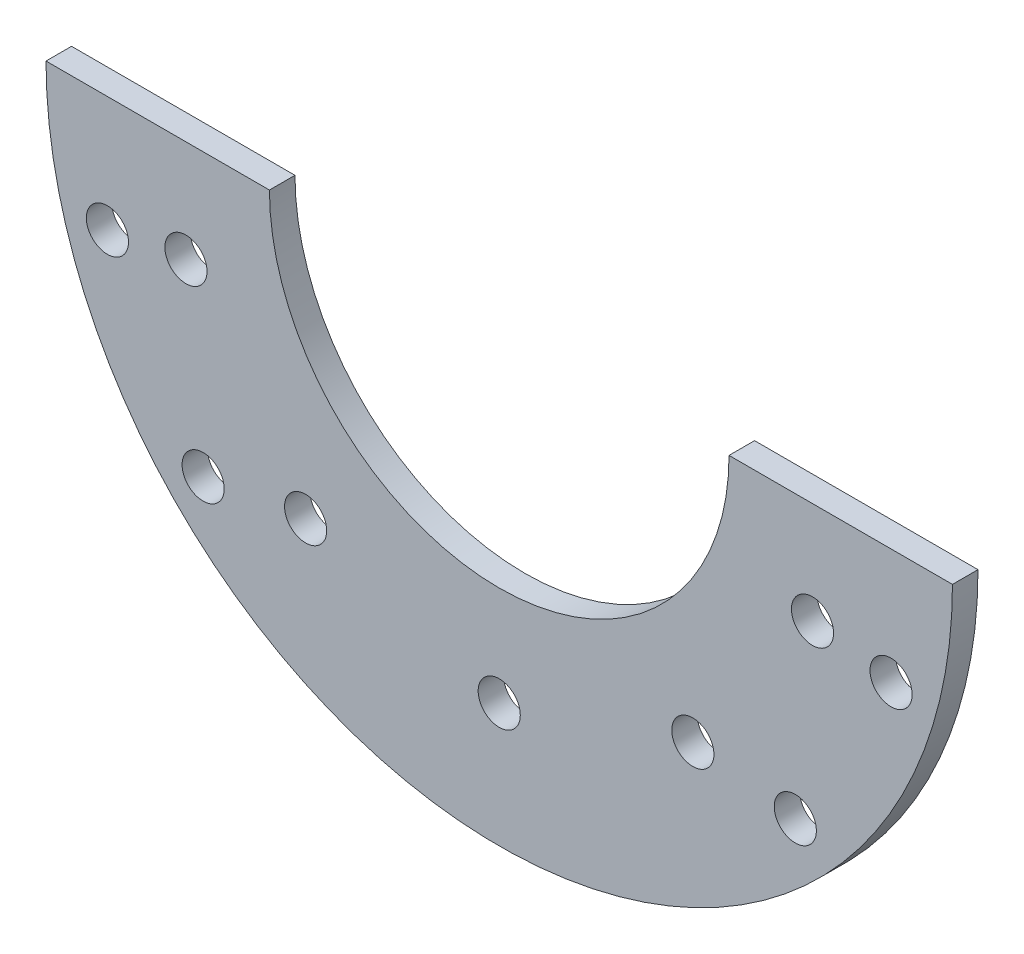
ISO-10303-21;
HEADER;
FILE_DESCRIPTION(('STEP AP214'),'2;1');
FILE_NAME('part.step','',(''),(''),'','','');
FILE_SCHEMA(('AUTOMOTIVE_DESIGN { 1 0 10303 214 1 1 1 1 }'));
ENDSEC;
DATA;
#1=APPLICATION_CONTEXT('core data for automotive mechanical design processes');
#2=APPLICATION_PROTOCOL_DEFINITION('international standard','automotive_design',2000,#1);
#3=PRODUCT_CONTEXT('',#1,'mechanical');
#4=PRODUCT('Part','Part','',(#3));
#5=PRODUCT_RELATED_PRODUCT_CATEGORY('part','',(#4));
#6=PRODUCT_DEFINITION_FORMATION('','',#4);
#7=PRODUCT_DEFINITION_CONTEXT('part definition',#1,'design');
#8=PRODUCT_DEFINITION('design','',#6,#7);
#9=PRODUCT_DEFINITION_SHAPE('','',#8);
#10=(LENGTH_UNIT() NAMED_UNIT(*) SI_UNIT(.MILLI.,.METRE.));
#11=(NAMED_UNIT(*) PLANE_ANGLE_UNIT() SI_UNIT($,.RADIAN.));
#12=(NAMED_UNIT(*) SI_UNIT($,.STERADIAN.) SOLID_ANGLE_UNIT());
#13=UNCERTAINTY_MEASURE_WITH_UNIT(LENGTH_MEASURE(1.E-05),#10,'distance_accuracy_value','');
#14=(GEOMETRIC_REPRESENTATION_CONTEXT(3) GLOBAL_UNCERTAINTY_ASSIGNED_CONTEXT((#13)) GLOBAL_UNIT_ASSIGNED_CONTEXT((#10,
#11,#12)) REPRESENTATION_CONTEXT('',''));
#15=CARTESIAN_POINT('',(0.,0.,0.));
#16=DIRECTION('',(0.,0.,1.));
#17=DIRECTION('',(1.,0.,0.));
#18=AXIS2_PLACEMENT_3D('',#15,#16,#17);
#19=CARTESIAN_POINT('',(0.,0.,0.));
#20=DIRECTION('',(0.,1.,0.));
#21=DIRECTION('',(0.,0.,1.));
#22=AXIS2_PLACEMENT_3D('',#19,#20,#21);
#23=PLANE('',#22);
#24=DIRECTION('',(-1.,0.,0.));
#25=VECTOR('',#24,1.);
#26=CARTESIAN_POINT('',(0.,0.,4.));
#27=LINE('',#26,#25);
#28=CARTESIAN_POINT('',(71.,0.,4.));
#29=VERTEX_POINT('',#28);
#30=CARTESIAN_POINT('',(36.,0.,4.));
#31=VERTEX_POINT('',#30);
#32=EDGE_CURVE('E80',#29,#31,#27,.T.);
#33=ORIENTED_EDGE('',*,*,#32,.F.);
#34=DIRECTION('',(0.,0.,-1.));
#35=VECTOR('',#34,1.);
#36=CARTESIAN_POINT('',(71.,0.,4.));
#37=LINE('',#36,#35);
#38=CARTESIAN_POINT('',(71.,0.,0.));
#39=VERTEX_POINT('',#38);
#40=EDGE_CURVE('E89',#29,#39,#37,.T.);
#41=ORIENTED_EDGE('',*,*,#40,.T.);
#42=DIRECTION('',(-1.,0.,0.));
#43=VECTOR('',#42,1.);
#44=CARTESIAN_POINT('',(0.,0.,0.));
#45=LINE('',#44,#43);
#46=CARTESIAN_POINT('',(36.,0.,0.));
#47=VERTEX_POINT('',#46);
#48=EDGE_CURVE('E90',#39,#47,#45,.T.);
#49=ORIENTED_EDGE('',*,*,#48,.T.);
#50=DIRECTION('',(0.,0.,-1.));
#51=VECTOR('',#50,1.);
#52=CARTESIAN_POINT('',(36.,0.,4.));
#53=LINE('',#52,#51);
#54=EDGE_CURVE('E50',#31,#47,#53,.T.);
#55=ORIENTED_EDGE('',*,*,#54,.F.);
#56=EDGE_LOOP('',(#33,#41,#49,#55));
#57=FACE_BOUND('',#56,.T.);
#58=ADVANCED_FACE('F33',(#57),#23,.T.);
#59=CARTESIAN_POINT('',(-36.,0.,0.));
#60=VERTEX_POINT('',#59);
#61=CARTESIAN_POINT('',(-71.,0.,0.));
#62=VERTEX_POINT('',#61);
#63=EDGE_CURVE('E94',#60,#62,#45,.T.);
#64=ORIENTED_EDGE('',*,*,#63,.T.);
#65=DIRECTION('',(0.,0.,-1.));
#66=VECTOR('',#65,1.);
#67=CARTESIAN_POINT('',(-71.,0.,4.));
#68=LINE('',#67,#66);
#69=CARTESIAN_POINT('',(-71.,0.,4.));
#70=VERTEX_POINT('',#69);
#71=EDGE_CURVE('E95',#62,#70,#68,.F.);
#72=ORIENTED_EDGE('',*,*,#71,.T.);
#73=CARTESIAN_POINT('',(-36.,0.,4.));
#74=VERTEX_POINT('',#73);
#75=EDGE_CURVE('E81',#74,#70,#27,.T.);
#76=ORIENTED_EDGE('',*,*,#75,.F.);
#77=DIRECTION('',(0.,0.,-1.));
#78=VECTOR('',#77,1.);
#79=CARTESIAN_POINT('',(-36.,0.,4.));
#80=LINE('',#79,#78);
#81=EDGE_CURVE('E58',#60,#74,#80,.F.);
#82=ORIENTED_EDGE('',*,*,#81,.F.);
#83=EDGE_LOOP('',(#64,#72,#76,#82));
#84=FACE_BOUND('',#83,.T.);
#85=ADVANCED_FACE('F161',(#84),#23,.T.);
#86=CARTESIAN_POINT('',(49.0745162408297,-15.9452769097482,4.));
#87=DIRECTION('',(0.,0.,-1.));
#88=DIRECTION('',(-1.,0.,0.));
#89=AXIS2_PLACEMENT_3D('',#86,#87,#88);
#90=CYLINDRICAL_SURFACE('',#89,3.3);
#91=CARTESIAN_POINT('',(49.0745162408297,-15.9452769097482,4.));
#92=DIRECTION('',(0.,0.,1.));
#93=DIRECTION('',(1.,0.,0.));
#94=AXIS2_PLACEMENT_3D('',#91,#92,#93);
#95=CIRCLE('',#94,3.3);
#96=CARTESIAN_POINT('',(52.3745162408296,-15.9452769097482,4.));
#97=VERTEX_POINT('',#96);
#98=EDGE_CURVE('E103',#97,#97,#95,.T.);
#99=ORIENTED_EDGE('',*,*,#98,.T.);
#100=EDGE_LOOP('',(#99));
#101=FACE_BOUND('',#100,.T.);
#102=CARTESIAN_POINT('',(49.0745162408297,-15.9452769097482,0.));
#103=DIRECTION('',(0.,0.,1.));
#104=DIRECTION('',(1.,0.,0.));
#105=AXIS2_PLACEMENT_3D('',#102,#103,#104);
#106=CIRCLE('',#105,3.3);
#107=CARTESIAN_POINT('',(52.3745162408296,-15.9452769097482,0.));
#108=VERTEX_POINT('',#107);
#109=EDGE_CURVE('E107',#108,#108,#106,.T.);
#110=ORIENTED_EDGE('',*,*,#109,.F.);
#111=EDGE_LOOP('',(#110));
#112=FACE_BOUND('',#111,.T.);
#113=ADVANCED_FACE('F163',(#101,#112),#90,.F.);
#114=CARTESIAN_POINT('',(30.3297190182908,-41.7452769097479,4.));
#115=DIRECTION('',(0.,0.,-1.));
#116=DIRECTION('',(-1.,0.,0.));
#117=AXIS2_PLACEMENT_3D('',#114,#115,#116);
#118=CYLINDRICAL_SURFACE('',#117,3.29999999999999);
#119=CARTESIAN_POINT('',(30.3297190182908,-41.7452769097479,4.));
#120=DIRECTION('',(0.,0.,1.));
#121=DIRECTION('',(1.,0.,0.));
#122=AXIS2_PLACEMENT_3D('',#119,#120,#121);
#123=CIRCLE('',#122,3.29999999999999);
#124=CARTESIAN_POINT('',(33.6297190182908,-41.7452769097479,4.));
#125=VERTEX_POINT('',#124);
#126=EDGE_CURVE('E112',#125,#125,#123,.T.);
#127=ORIENTED_EDGE('',*,*,#126,.T.);
#128=EDGE_LOOP('',(#127));
#129=FACE_BOUND('',#128,.T.);
#130=CARTESIAN_POINT('',(30.3297190182908,-41.7452769097479,0.));
#131=DIRECTION('',(0.,0.,1.));
#132=DIRECTION('',(1.,0.,0.));
#133=AXIS2_PLACEMENT_3D('',#130,#131,#132);
#134=CIRCLE('',#133,3.29999999999999);
#135=CARTESIAN_POINT('',(33.6297190182908,-41.7452769097479,0.));
#136=VERTEX_POINT('',#135);
#137=EDGE_CURVE('E115',#136,#136,#134,.T.);
#138=ORIENTED_EDGE('',*,*,#137,.F.);
#139=EDGE_LOOP('',(#138));
#140=FACE_BOUND('',#139,.T.);
#141=ADVANCED_FACE('F169',(#129,#140),#118,.F.);
#142=CARTESIAN_POINT('',(-1.06165076729781E-12,-51.6,4.));
#143=DIRECTION('',(0.,0.,-1.));
#144=DIRECTION('',(-1.,0.,0.));
#145=AXIS2_PLACEMENT_3D('',#142,#143,#144);
#146=CYLINDRICAL_SURFACE('',#145,3.30000000000001);
#147=CARTESIAN_POINT('',(-1.06165076729781E-12,-51.6,4.));
#148=DIRECTION('',(0.,0.,1.));
#149=DIRECTION('',(1.,0.,0.));
#150=AXIS2_PLACEMENT_3D('',#147,#148,#149);
#151=CIRCLE('',#150,3.30000000000001);
#152=CARTESIAN_POINT('',(3.29999999999894,-51.6,4.));
#153=VERTEX_POINT('',#152);
#154=EDGE_CURVE('E118',#153,#153,#151,.T.);
#155=ORIENTED_EDGE('',*,*,#154,.T.);
#156=EDGE_LOOP('',(#155));
#157=FACE_BOUND('',#156,.T.);
#158=CARTESIAN_POINT('',(-1.06165076729781E-12,-51.6,0.));
#159=DIRECTION('',(0.,0.,1.));
#160=DIRECTION('',(1.,0.,0.));
#161=AXIS2_PLACEMENT_3D('',#158,#159,#160);
#162=CIRCLE('',#161,3.30000000000001);
#163=CARTESIAN_POINT('',(3.29999999999894,-51.6,0.));
#164=VERTEX_POINT('',#163);
#165=EDGE_CURVE('E121',#164,#164,#162,.T.);
#166=ORIENTED_EDGE('',*,*,#165,.F.);
#167=EDGE_LOOP('',(#166));
#168=FACE_BOUND('',#167,.T.);
#169=ADVANCED_FACE('F238',(#157,#168),#146,.F.);
#170=CARTESIAN_POINT('',(-30.329719018292,-41.7452769097471,4.));
#171=DIRECTION('',(0.,0.,-1.));
#172=DIRECTION('',(-1.,0.,0.));
#173=AXIS2_PLACEMENT_3D('',#170,#171,#172);
#174=CYLINDRICAL_SURFACE('',#173,3.3);
#175=CARTESIAN_POINT('',(-30.329719018292,-41.7452769097471,4.));
#176=DIRECTION('',(0.,0.,1.));
#177=DIRECTION('',(1.,0.,0.));
#178=AXIS2_PLACEMENT_3D('',#175,#176,#177);
#179=CIRCLE('',#178,3.3);
#180=CARTESIAN_POINT('',(-27.029719018292,-41.7452769097471,4.));
#181=VERTEX_POINT('',#180);
#182=EDGE_CURVE('E124',#181,#181,#179,.T.);
#183=ORIENTED_EDGE('',*,*,#182,.T.);
#184=EDGE_LOOP('',(#183));
#185=FACE_BOUND('',#184,.T.);
#186=CARTESIAN_POINT('',(-30.329719018292,-41.7452769097471,0.));
#187=DIRECTION('',(0.,0.,1.));
#188=DIRECTION('',(1.,0.,0.));
#189=AXIS2_PLACEMENT_3D('',#186,#187,#188);
#190=CIRCLE('',#189,3.3);
#191=CARTESIAN_POINT('',(-27.029719018292,-41.7452769097471,0.));
#192=VERTEX_POINT('',#191);
#193=EDGE_CURVE('E127',#192,#192,#190,.T.);
#194=ORIENTED_EDGE('',*,*,#193,.F.);
#195=EDGE_LOOP('',(#194));
#196=FACE_BOUND('',#195,.T.);
#197=ADVANCED_FACE('F230',(#185,#196),#174,.F.);
#198=CARTESIAN_POINT('',(-49.0745162408299,-15.9452769097473,4.));
#199=DIRECTION('',(0.,0.,-1.));
#200=DIRECTION('',(-1.,0.,0.));
#201=AXIS2_PLACEMENT_3D('',#198,#199,#200);
#202=CYLINDRICAL_SURFACE('',#201,3.29999999999998);
#203=CARTESIAN_POINT('',(-49.0745162408299,-15.9452769097473,4.));
#204=DIRECTION('',(0.,0.,1.));
#205=DIRECTION('',(1.,0.,0.));
#206=AXIS2_PLACEMENT_3D('',#203,#204,#205);
#207=CIRCLE('',#206,3.29999999999998);
#208=CARTESIAN_POINT('',(-45.7745162408299,-15.9452769097473,4.));
#209=VERTEX_POINT('',#208);
#210=EDGE_CURVE('E130',#209,#209,#207,.T.);
#211=ORIENTED_EDGE('',*,*,#210,.T.);
#212=EDGE_LOOP('',(#211));
#213=FACE_BOUND('',#212,.T.);
#214=CARTESIAN_POINT('',(-49.0745162408299,-15.9452769097473,0.));
#215=DIRECTION('',(0.,0.,1.));
#216=DIRECTION('',(1.,0.,0.));
#217=AXIS2_PLACEMENT_3D('',#214,#215,#216);
#218=CIRCLE('',#217,3.29999999999998);
#219=CARTESIAN_POINT('',(-45.7745162408299,-15.9452769097473,0.));
#220=VERTEX_POINT('',#219);
#221=EDGE_CURVE('E133',#220,#220,#218,.T.);
#222=ORIENTED_EDGE('',*,*,#221,.F.);
#223=EDGE_LOOP('',(#222));
#224=FACE_BOUND('',#223,.T.);
#225=ADVANCED_FACE('F222',(#213,#224),#202,.F.);
#226=CARTESIAN_POINT('',(61.3818151141923,-18.118299403838,4.));
#227=DIRECTION('',(0.,0.,-1.));
#228=DIRECTION('',(-1.,0.,0.));
#229=AXIS2_PLACEMENT_3D('',#226,#227,#228);
#230=CYLINDRICAL_SURFACE('',#229,3.29999999999999);
#231=CARTESIAN_POINT('',(61.3818151141923,-18.118299403838,4.));
#232=DIRECTION('',(0.,0.,1.));
#233=DIRECTION('',(1.,0.,0.));
#234=AXIS2_PLACEMENT_3D('',#231,#232,#233);
#235=CIRCLE('',#234,3.29999999999999);
#236=CARTESIAN_POINT('',(64.6818151141923,-18.118299403838,4.));
#237=VERTEX_POINT('',#236);
#238=EDGE_CURVE('E136',#237,#237,#235,.T.);
#239=ORIENTED_EDGE('',*,*,#238,.T.);
#240=EDGE_LOOP('',(#239));
#241=FACE_BOUND('',#240,.T.);
#242=CARTESIAN_POINT('',(61.3818151141923,-18.118299403838,0.));
#243=DIRECTION('',(0.,0.,1.));
#244=DIRECTION('',(1.,0.,0.));
#245=AXIS2_PLACEMENT_3D('',#242,#243,#244);
#246=CIRCLE('',#245,3.29999999999999);
#247=CARTESIAN_POINT('',(64.6818151141923,-18.118299403838,0.));
#248=VERTEX_POINT('',#247);
#249=EDGE_CURVE('E139',#248,#248,#246,.T.);
#250=ORIENTED_EDGE('',*,*,#249,.F.);
#251=EDGE_LOOP('',(#250));
#252=FACE_BOUND('',#251,.T.);
#253=ADVANCED_FACE('F214',(#241,#252),#230,.F.);
#254=CARTESIAN_POINT('',(46.3818151141923,-44.0990615173711,4.));
#255=DIRECTION('',(0.,0.,-1.));
#256=DIRECTION('',(-1.,0.,0.));
#257=AXIS2_PLACEMENT_3D('',#254,#255,#256);
#258=CYLINDRICAL_SURFACE('',#257,3.3);
#259=CARTESIAN_POINT('',(46.3818151141923,-44.0990615173711,4.));
#260=DIRECTION('',(0.,0.,1.));
#261=DIRECTION('',(1.,0.,0.));
#262=AXIS2_PLACEMENT_3D('',#259,#260,#261);
#263=CIRCLE('',#262,3.3);
#264=CARTESIAN_POINT('',(49.6818151141923,-44.0990615173711,4.));
#265=VERTEX_POINT('',#264);
#266=EDGE_CURVE('E142',#265,#265,#263,.T.);
#267=ORIENTED_EDGE('',*,*,#266,.T.);
#268=EDGE_LOOP('',(#267));
#269=FACE_BOUND('',#268,.T.);
#270=CARTESIAN_POINT('',(46.3818151141923,-44.0990615173711,0.));
#271=DIRECTION('',(0.,0.,1.));
#272=DIRECTION('',(1.,0.,0.));
#273=AXIS2_PLACEMENT_3D('',#270,#271,#272);
#274=CIRCLE('',#273,3.3);
#275=CARTESIAN_POINT('',(49.6818151141923,-44.0990615173711,0.));
#276=VERTEX_POINT('',#275);
#277=EDGE_CURVE('E145',#276,#276,#274,.T.);
#278=ORIENTED_EDGE('',*,*,#277,.F.);
#279=EDGE_LOOP('',(#278));
#280=FACE_BOUND('',#279,.T.);
#281=ADVANCED_FACE('F207',(#269,#280),#258,.F.);
#282=CARTESIAN_POINT('',(-46.3818151141923,-44.0990615173712,4.));
#283=DIRECTION('',(0.,0.,-1.));
#284=DIRECTION('',(-1.,0.,0.));
#285=AXIS2_PLACEMENT_3D('',#282,#283,#284);
#286=CYLINDRICAL_SURFACE('',#285,3.3);
#287=CARTESIAN_POINT('',(-46.3818151141923,-44.0990615173712,4.));
#288=DIRECTION('',(0.,0.,1.));
#289=DIRECTION('',(1.,0.,0.));
#290=AXIS2_PLACEMENT_3D('',#287,#288,#289);
#291=CIRCLE('',#290,3.3);
#292=CARTESIAN_POINT('',(-43.0818151141923,-44.0990615173712,4.));
#293=VERTEX_POINT('',#292);
#294=EDGE_CURVE('E148',#293,#293,#291,.T.);
#295=ORIENTED_EDGE('',*,*,#294,.T.);
#296=EDGE_LOOP('',(#295));
#297=FACE_BOUND('',#296,.T.);
#298=CARTESIAN_POINT('',(-46.3818151141923,-44.0990615173712,0.));
#299=DIRECTION('',(0.,0.,1.));
#300=DIRECTION('',(1.,0.,0.));
#301=AXIS2_PLACEMENT_3D('',#298,#299,#300);
#302=CIRCLE('',#301,3.3);
#303=CARTESIAN_POINT('',(-43.0818151141923,-44.0990615173712,0.));
#304=VERTEX_POINT('',#303);
#305=EDGE_CURVE('E151',#304,#304,#302,.T.);
#306=ORIENTED_EDGE('',*,*,#305,.F.);
#307=EDGE_LOOP('',(#306));
#308=FACE_BOUND('',#307,.T.);
#309=ADVANCED_FACE('F200',(#297,#308),#286,.F.);
#310=CARTESIAN_POINT('',(-61.3818151141923,-18.118299403838,4.));
#311=DIRECTION('',(0.,0.,-1.));
#312=DIRECTION('',(-1.,0.,0.));
#313=AXIS2_PLACEMENT_3D('',#310,#311,#312);
#314=CYLINDRICAL_SURFACE('',#313,3.3);
#315=CARTESIAN_POINT('',(-61.3818151141923,-18.118299403838,4.));
#316=DIRECTION('',(0.,0.,1.));
#317=DIRECTION('',(1.,0.,0.));
#318=AXIS2_PLACEMENT_3D('',#315,#316,#317);
#319=CIRCLE('',#318,3.3);
#320=CARTESIAN_POINT('',(-58.0818151141923,-18.118299403838,4.));
#321=VERTEX_POINT('',#320);
#322=EDGE_CURVE('E42',#321,#321,#319,.T.);
#323=ORIENTED_EDGE('',*,*,#322,.T.);
#324=EDGE_LOOP('',(#323));
#325=FACE_BOUND('',#324,.T.);
#326=CARTESIAN_POINT('',(-61.3818151141923,-18.118299403838,0.));
#327=DIRECTION('',(0.,0.,1.));
#328=DIRECTION('',(1.,0.,0.));
#329=AXIS2_PLACEMENT_3D('',#326,#327,#328);
#330=CIRCLE('',#329,3.3);
#331=CARTESIAN_POINT('',(-58.0818151141923,-18.118299403838,0.));
#332=VERTEX_POINT('',#331);
#333=EDGE_CURVE('E11',#332,#332,#330,.T.);
#334=ORIENTED_EDGE('',*,*,#333,.F.);
#335=EDGE_LOOP('',(#334));
#336=FACE_BOUND('',#335,.T.);
#337=ADVANCED_FACE('F173',(#325,#336),#314,.F.);
#338=CARTESIAN_POINT('',(0.,0.,0.));
#339=DIRECTION('',(0.,0.,1.));
#340=DIRECTION('',(1.,0.,0.));
#341=AXIS2_PLACEMENT_3D('',#338,#339,#340);
#342=PLANE('',#341);
#343=ORIENTED_EDGE('',*,*,#333,.T.);
#344=EDGE_LOOP('',(#343));
#345=FACE_BOUND('',#344,.T.);
#346=ORIENTED_EDGE('',*,*,#305,.T.);
#347=EDGE_LOOP('',(#346));
#348=FACE_BOUND('',#347,.T.);
#349=ORIENTED_EDGE('',*,*,#277,.T.);
#350=EDGE_LOOP('',(#349));
#351=FACE_BOUND('',#350,.T.);
#352=ORIENTED_EDGE('',*,*,#249,.T.);
#353=EDGE_LOOP('',(#352));
#354=FACE_BOUND('',#353,.T.);
#355=ORIENTED_EDGE('',*,*,#221,.T.);
#356=EDGE_LOOP('',(#355));
#357=FACE_BOUND('',#356,.T.);
#358=ORIENTED_EDGE('',*,*,#193,.T.);
#359=EDGE_LOOP('',(#358));
#360=FACE_BOUND('',#359,.T.);
#361=ORIENTED_EDGE('',*,*,#165,.T.);
#362=EDGE_LOOP('',(#361));
#363=FACE_BOUND('',#362,.T.);
#364=ORIENTED_EDGE('',*,*,#137,.T.);
#365=EDGE_LOOP('',(#364));
#366=FACE_BOUND('',#365,.T.);
#367=ORIENTED_EDGE('',*,*,#109,.T.);
#368=EDGE_LOOP('',(#367));
#369=FACE_BOUND('',#368,.T.);
#370=ORIENTED_EDGE('',*,*,#48,.F.);
#371=CARTESIAN_POINT('',(0.,0.,0.));
#372=DIRECTION('',(0.,0.,1.));
#373=DIRECTION('',(1.,0.,0.));
#374=AXIS2_PLACEMENT_3D('',#371,#372,#373);
#375=CIRCLE('',#374,71.);
#376=EDGE_CURVE('E86',#62,#39,#375,.T.);
#377=ORIENTED_EDGE('',*,*,#376,.F.);
#378=ORIENTED_EDGE('',*,*,#63,.F.);
#379=CARTESIAN_POINT('',(0.,0.,0.));
#380=DIRECTION('',(0.,0.,1.));
#381=DIRECTION('',(1.,0.,0.));
#382=AXIS2_PLACEMENT_3D('',#379,#380,#381);
#383=CIRCLE('',#382,36.);
#384=EDGE_CURVE('E37',#60,#47,#383,.T.);
#385=ORIENTED_EDGE('',*,*,#384,.T.);
#386=EDGE_LOOP('',(#370,#377,#378,#385));
#387=FACE_BOUND('',#386,.T.);
#388=ADVANCED_FACE('F159',(#345,#348,#351,#354,#357,#360,#363,#366,#369,#387),#342,.F.);
#389=CARTESIAN_POINT('',(0.,0.,4.));
#390=DIRECTION('',(0.,0.,1.));
#391=DIRECTION('',(1.,0.,0.));
#392=AXIS2_PLACEMENT_3D('',#389,#390,#391);
#393=PLANE('',#392);
#394=ORIENTED_EDGE('',*,*,#322,.F.);
#395=EDGE_LOOP('',(#394));
#396=FACE_BOUND('',#395,.T.);
#397=ORIENTED_EDGE('',*,*,#266,.F.);
#398=EDGE_LOOP('',(#397));
#399=FACE_BOUND('',#398,.T.);
#400=ORIENTED_EDGE('',*,*,#210,.F.);
#401=EDGE_LOOP('',(#400));
#402=FACE_BOUND('',#401,.T.);
#403=ORIENTED_EDGE('',*,*,#154,.F.);
#404=EDGE_LOOP('',(#403));
#405=FACE_BOUND('',#404,.T.);
#406=ORIENTED_EDGE('',*,*,#98,.F.);
#407=EDGE_LOOP('',(#406));
#408=FACE_BOUND('',#407,.T.);
#409=ORIENTED_EDGE('',*,*,#126,.F.);
#410=EDGE_LOOP('',(#409));
#411=FACE_BOUND('',#410,.T.);
#412=ORIENTED_EDGE('',*,*,#182,.F.);
#413=EDGE_LOOP('',(#412));
#414=FACE_BOUND('',#413,.T.);
#415=ORIENTED_EDGE('',*,*,#238,.F.);
#416=EDGE_LOOP('',(#415));
#417=FACE_BOUND('',#416,.T.);
#418=ORIENTED_EDGE('',*,*,#294,.F.);
#419=EDGE_LOOP('',(#418));
#420=FACE_BOUND('',#419,.T.);
#421=CARTESIAN_POINT('',(0.,0.,4.));
#422=DIRECTION('',(0.,0.,1.));
#423=DIRECTION('',(1.,0.,0.));
#424=AXIS2_PLACEMENT_3D('',#421,#422,#423);
#425=CIRCLE('',#424,71.);
#426=EDGE_CURVE('E77',#70,#29,#425,.T.);
#427=ORIENTED_EDGE('',*,*,#426,.T.);
#428=ORIENTED_EDGE('',*,*,#32,.T.);
#429=CARTESIAN_POINT('',(0.,0.,4.));
#430=DIRECTION('',(0.,0.,1.));
#431=DIRECTION('',(1.,0.,0.));
#432=AXIS2_PLACEMENT_3D('',#429,#430,#431);
#433=CIRCLE('',#432,36.);
#434=EDGE_CURVE('E101',#74,#31,#433,.T.);
#435=ORIENTED_EDGE('',*,*,#434,.F.);
#436=ORIENTED_EDGE('',*,*,#75,.T.);
#437=EDGE_LOOP('',(#427,#428,#435,#436));
#438=FACE_BOUND('',#437,.T.);
#439=ADVANCED_FACE('F78',(#396,#399,#402,#405,#408,#411,#414,#417,#420,#438),#393,.T.);
#440=CARTESIAN_POINT('',(0.,0.,4.));
#441=DIRECTION('',(0.,0.,-1.));
#442=DIRECTION('',(-1.,0.,0.));
#443=AXIS2_PLACEMENT_3D('',#440,#441,#442);
#444=CYLINDRICAL_SURFACE('',#443,36.);
#445=ORIENTED_EDGE('',*,*,#434,.T.);
#446=ORIENTED_EDGE('',*,*,#54,.T.);
#447=ORIENTED_EDGE('',*,*,#384,.F.);
#448=ORIENTED_EDGE('',*,*,#81,.T.);
#449=EDGE_LOOP('',(#445,#446,#447,#448));
#450=FACE_BOUND('',#449,.T.);
#451=ADVANCED_FACE('F35',(#450),#444,.F.);
#452=CARTESIAN_POINT('',(0.,0.,4.));
#453=DIRECTION('',(0.,0.,-1.));
#454=DIRECTION('',(-1.,0.,0.));
#455=AXIS2_PLACEMENT_3D('',#452,#453,#454);
#456=CYLINDRICAL_SURFACE('',#455,71.);
#457=ORIENTED_EDGE('',*,*,#40,.F.);
#458=ORIENTED_EDGE('',*,*,#426,.F.);
#459=ORIENTED_EDGE('',*,*,#71,.F.);
#460=ORIENTED_EDGE('',*,*,#376,.T.);
#461=EDGE_LOOP('',(#457,#458,#459,#460));
#462=FACE_BOUND('',#461,.T.);
#463=ADVANCED_FACE('F92',(#462),#456,.T.);
#464=CLOSED_SHELL('',(#58,#85,#113,#141,#169,#197,#225,#253,#281,#309,#337,#388,#439,#451,#463));
#465=MANIFOLD_SOLID_BREP('B2',#464);
#466=ADVANCED_BREP_SHAPE_REPRESENTATION('',(#18,#465),#14);
#467=SHAPE_DEFINITION_REPRESENTATION(#9,#466);
ENDSEC;
END-ISO-10303-21;
